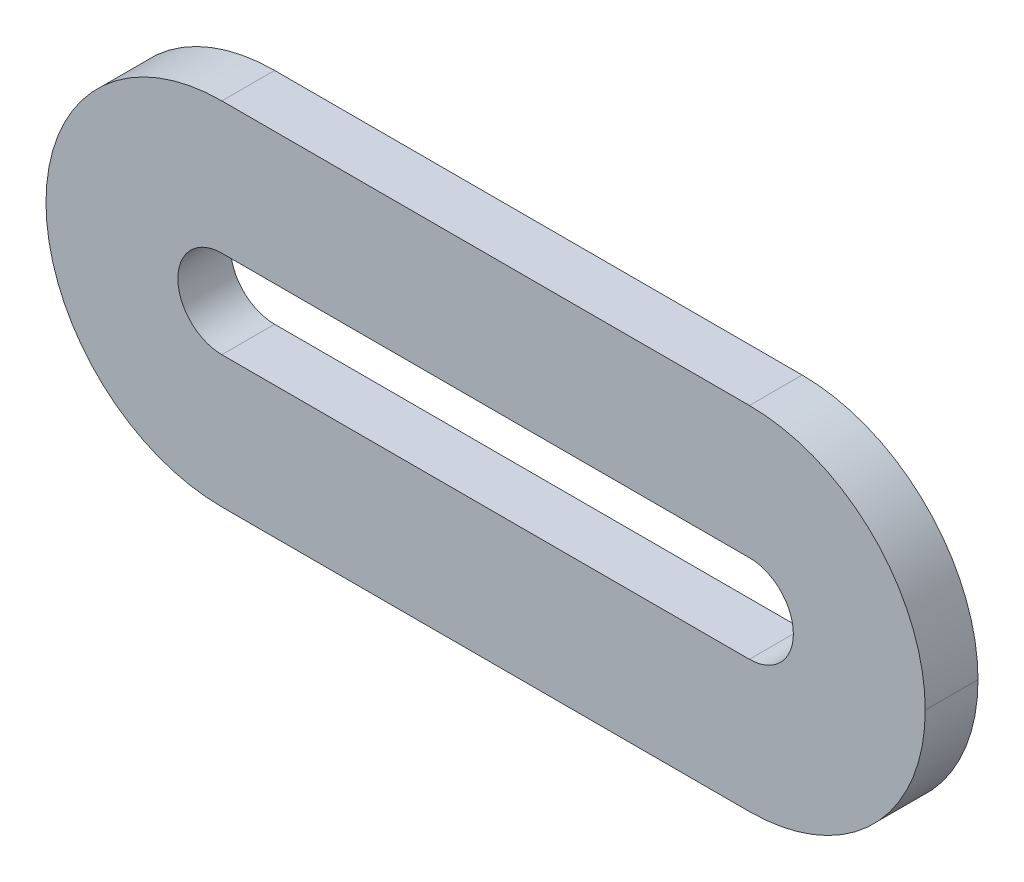
ISO-10303-21;
HEADER;
FILE_DESCRIPTION(('STEP AP214'),'2;1');
FILE_NAME('part.step','',(''),(''),'','','');
FILE_SCHEMA(('AUTOMOTIVE_DESIGN { 1 0 10303 214 1 1 1 1 }'));
ENDSEC;
DATA;
#1=APPLICATION_CONTEXT('core data for automotive mechanical design processes');
#2=APPLICATION_PROTOCOL_DEFINITION('international standard','automotive_design',2000,#1);
#3=PRODUCT_CONTEXT('',#1,'mechanical');
#4=PRODUCT('Part','Part','',(#3));
#5=PRODUCT_RELATED_PRODUCT_CATEGORY('part','',(#4));
#6=PRODUCT_DEFINITION_FORMATION('','',#4);
#7=PRODUCT_DEFINITION_CONTEXT('part definition',#1,'design');
#8=PRODUCT_DEFINITION('design','',#6,#7);
#9=PRODUCT_DEFINITION_SHAPE('','',#8);
#10=(LENGTH_UNIT() NAMED_UNIT(*) SI_UNIT(.MILLI.,.METRE.));
#11=(NAMED_UNIT(*) PLANE_ANGLE_UNIT() SI_UNIT($,.RADIAN.));
#12=(NAMED_UNIT(*) SI_UNIT($,.STERADIAN.) SOLID_ANGLE_UNIT());
#13=UNCERTAINTY_MEASURE_WITH_UNIT(LENGTH_MEASURE(1.E-05),#10,'distance_accuracy_value','');
#14=(GEOMETRIC_REPRESENTATION_CONTEXT(3) GLOBAL_UNCERTAINTY_ASSIGNED_CONTEXT((#13)) GLOBAL_UNIT_ASSIGNED_CONTEXT((#10,
#11,#12)) REPRESENTATION_CONTEXT('',''));
#15=CARTESIAN_POINT('',(0.,0.,0.));
#16=DIRECTION('',(0.,0.,1.));
#17=DIRECTION('',(1.,0.,0.));
#18=AXIS2_PLACEMENT_3D('',#15,#16,#17);
#19=CARTESIAN_POINT('',(0.,0.,3.));
#20=DIRECTION('',(0.,0.,-1.));
#21=DIRECTION('',(-1.,0.,0.));
#22=AXIS2_PLACEMENT_3D('',#19,#20,#21);
#23=PLANE('',#22);
#24=CARTESIAN_POINT('',(-15.,0.,3.));
#25=DIRECTION('',(0.,0.,-1.));
#26=DIRECTION('',(-1.,0.,0.));
#27=AXIS2_PLACEMENT_3D('',#24,#25,#26);
#28=CIRCLE('',#27,10.);
#29=CARTESIAN_POINT('',(-15.,10.,3.));
#30=VERTEX_POINT('',#29);
#31=CARTESIAN_POINT('',(-25.,0.,3.));
#32=VERTEX_POINT('',#31);
#33=EDGE_CURVE('E49',#30,#32,#28,.F.);
#34=ORIENTED_EDGE('',*,*,#33,.T.);
#35=CARTESIAN_POINT('',(-15.,0.,3.));
#36=DIRECTION('',(0.,0.,-1.));
#37=DIRECTION('',(-1.,0.,0.));
#38=AXIS2_PLACEMENT_3D('',#35,#36,#37);
#39=CIRCLE('',#38,10.);
#40=CARTESIAN_POINT('',(-15.,-10.,3.));
#41=VERTEX_POINT('',#40);
#42=EDGE_CURVE('E182',#32,#41,#39,.F.);
#43=ORIENTED_EDGE('',*,*,#42,.T.);
#44=DIRECTION('',(1.,0.,0.));
#45=VECTOR('',#44,1.);
#46=CARTESIAN_POINT('',(-25.,-10.,3.));
#47=LINE('',#46,#45);
#48=CARTESIAN_POINT('',(15.,-10.,3.));
#49=VERTEX_POINT('',#48);
#50=EDGE_CURVE('E156',#41,#49,#47,.T.);
#51=ORIENTED_EDGE('',*,*,#50,.T.);
#52=CARTESIAN_POINT('',(15.,0.,3.));
#53=DIRECTION('',(0.,0.,-1.));
#54=DIRECTION('',(-1.,0.,0.));
#55=AXIS2_PLACEMENT_3D('',#52,#53,#54);
#56=CIRCLE('',#55,10.);
#57=CARTESIAN_POINT('',(25.,0.,3.));
#58=VERTEX_POINT('',#57);
#59=EDGE_CURVE('E179',#49,#58,#56,.F.);
#60=ORIENTED_EDGE('',*,*,#59,.T.);
#61=CARTESIAN_POINT('',(15.,0.,3.));
#62=DIRECTION('',(0.,0.,-1.));
#63=DIRECTION('',(-1.,0.,0.));
#64=AXIS2_PLACEMENT_3D('',#61,#62,#63);
#65=CIRCLE('',#64,10.);
#66=CARTESIAN_POINT('',(15.,10.,3.));
#67=VERTEX_POINT('',#66);
#68=EDGE_CURVE('E177',#58,#67,#65,.F.);
#69=ORIENTED_EDGE('',*,*,#68,.T.);
#70=DIRECTION('',(-1.,0.,0.));
#71=VECTOR('',#70,1.);
#72=CARTESIAN_POINT('',(-25.,10.,3.));
#73=LINE('',#72,#71);
#74=EDGE_CURVE('E154',#67,#30,#73,.T.);
#75=ORIENTED_EDGE('',*,*,#74,.T.);
#76=EDGE_LOOP('',(#34,#43,#51,#60,#69,#75));
#77=FACE_BOUND('',#76,.T.);
#78=CARTESIAN_POINT('',(-15.,0.,3.));
#79=DIRECTION('',(0.,0.,1.));
#80=DIRECTION('',(1.,0.,0.));
#81=AXIS2_PLACEMENT_3D('',#78,#79,#80);
#82=CIRCLE('',#81,2.5);
#83=CARTESIAN_POINT('',(-15.,2.5,3.));
#84=VERTEX_POINT('',#83);
#85=CARTESIAN_POINT('',(-15.,-2.5,3.));
#86=VERTEX_POINT('',#85);
#87=EDGE_CURVE('E112',#84,#86,#82,.T.);
#88=ORIENTED_EDGE('',*,*,#87,.F.);
#89=DIRECTION('',(-1.,0.,0.));
#90=VECTOR('',#89,1.);
#91=CARTESIAN_POINT('',(-15.,2.5,3.));
#92=LINE('',#91,#90);
#93=CARTESIAN_POINT('',(15.,2.50000000000001,3.));
#94=VERTEX_POINT('',#93);
#95=EDGE_CURVE('E137',#94,#84,#92,.T.);
#96=ORIENTED_EDGE('',*,*,#95,.F.);
#97=CARTESIAN_POINT('',(15.,0.,3.));
#98=DIRECTION('',(0.,0.,1.));
#99=DIRECTION('',(1.,0.,0.));
#100=AXIS2_PLACEMENT_3D('',#97,#98,#99);
#101=CIRCLE('',#100,2.5);
#102=CARTESIAN_POINT('',(15.,-2.49999999999999,3.));
#103=VERTEX_POINT('',#102);
#104=EDGE_CURVE('E135',#103,#94,#101,.T.);
#105=ORIENTED_EDGE('',*,*,#104,.F.);
#106=DIRECTION('',(1.,0.,0.));
#107=VECTOR('',#106,1.);
#108=CARTESIAN_POINT('',(-15.,-2.5,3.));
#109=LINE('',#108,#107);
#110=EDGE_CURVE('E122',#86,#103,#109,.T.);
#111=ORIENTED_EDGE('',*,*,#110,.F.);
#112=EDGE_LOOP('',(#88,#96,#105,#111));
#113=FACE_BOUND('',#112,.T.);
#114=ADVANCED_FACE('F32',(#77,#113),#23,.F.);
#115=CARTESIAN_POINT('',(0.,0.,0.));
#116=DIRECTION('',(0.,0.,-1.));
#117=DIRECTION('',(-1.,0.,0.));
#118=AXIS2_PLACEMENT_3D('',#115,#116,#117);
#119=PLANE('',#118);
#120=DIRECTION('',(1.,0.,0.));
#121=VECTOR('',#120,1.);
#122=CARTESIAN_POINT('',(-25.,-10.,0.));
#123=LINE('',#122,#121);
#124=CARTESIAN_POINT('',(-15.,-10.,0.));
#125=VERTEX_POINT('',#124);
#126=CARTESIAN_POINT('',(15.,-10.,0.));
#127=VERTEX_POINT('',#126);
#128=EDGE_CURVE('E157',#125,#127,#123,.T.);
#129=ORIENTED_EDGE('',*,*,#128,.F.);
#130=CARTESIAN_POINT('',(-15.,0.,0.));
#131=DIRECTION('',(0.,0.,-1.));
#132=DIRECTION('',(-1.,0.,0.));
#133=AXIS2_PLACEMENT_3D('',#130,#131,#132);
#134=CIRCLE('',#133,10.);
#135=CARTESIAN_POINT('',(-25.,0.,0.));
#136=VERTEX_POINT('',#135);
#137=EDGE_CURVE('E169',#125,#136,#134,.T.);
#138=ORIENTED_EDGE('',*,*,#137,.T.);
#139=CARTESIAN_POINT('',(-15.,0.,0.));
#140=DIRECTION('',(0.,0.,-1.));
#141=DIRECTION('',(-1.,0.,0.));
#142=AXIS2_PLACEMENT_3D('',#139,#140,#141);
#143=CIRCLE('',#142,10.);
#144=CARTESIAN_POINT('',(-15.,10.,0.));
#145=VERTEX_POINT('',#144);
#146=EDGE_CURVE('E167',#136,#145,#143,.T.);
#147=ORIENTED_EDGE('',*,*,#146,.T.);
#148=DIRECTION('',(-1.,0.,0.));
#149=VECTOR('',#148,1.);
#150=CARTESIAN_POINT('',(-25.,10.,0.));
#151=LINE('',#150,#149);
#152=CARTESIAN_POINT('',(15.,10.,0.));
#153=VERTEX_POINT('',#152);
#154=EDGE_CURVE('E130',#153,#145,#151,.T.);
#155=ORIENTED_EDGE('',*,*,#154,.F.);
#156=CARTESIAN_POINT('',(15.,0.,0.));
#157=DIRECTION('',(0.,0.,-1.));
#158=DIRECTION('',(-1.,0.,0.));
#159=AXIS2_PLACEMENT_3D('',#156,#157,#158);
#160=CIRCLE('',#159,10.);
#161=CARTESIAN_POINT('',(25.,0.,0.));
#162=VERTEX_POINT('',#161);
#163=EDGE_CURVE('E160',#153,#162,#160,.T.);
#164=ORIENTED_EDGE('',*,*,#163,.T.);
#165=CARTESIAN_POINT('',(15.,0.,0.));
#166=DIRECTION('',(0.,0.,-1.));
#167=DIRECTION('',(-1.,0.,0.));
#168=AXIS2_PLACEMENT_3D('',#165,#166,#167);
#169=CIRCLE('',#168,10.);
#170=EDGE_CURVE('E165',#162,#127,#169,.T.);
#171=ORIENTED_EDGE('',*,*,#170,.T.);
#172=EDGE_LOOP('',(#129,#138,#147,#155,#164,#171));
#173=FACE_BOUND('',#172,.T.);
#174=DIRECTION('',(-1.,0.,0.));
#175=VECTOR('',#174,1.);
#176=CARTESIAN_POINT('',(-15.,2.5,0.));
#177=LINE('',#176,#175);
#178=CARTESIAN_POINT('',(15.,2.50000000000001,0.));
#179=VERTEX_POINT('',#178);
#180=CARTESIAN_POINT('',(-15.,2.5,0.));
#181=VERTEX_POINT('',#180);
#182=EDGE_CURVE('E123',#179,#181,#177,.T.);
#183=ORIENTED_EDGE('',*,*,#182,.T.);
#184=CARTESIAN_POINT('',(-15.,0.,0.));
#185=DIRECTION('',(0.,0.,1.));
#186=DIRECTION('',(1.,0.,0.));
#187=AXIS2_PLACEMENT_3D('',#184,#185,#186);
#188=CIRCLE('',#187,2.5);
#189=CARTESIAN_POINT('',(-15.,-2.5,0.));
#190=VERTEX_POINT('',#189);
#191=EDGE_CURVE('E141',#181,#190,#188,.T.);
#192=ORIENTED_EDGE('',*,*,#191,.T.);
#193=DIRECTION('',(1.,0.,0.));
#194=VECTOR('',#193,1.);
#195=CARTESIAN_POINT('',(-15.,-2.5,0.));
#196=LINE('',#195,#194);
#197=CARTESIAN_POINT('',(15.,-2.49999999999999,0.));
#198=VERTEX_POINT('',#197);
#199=EDGE_CURVE('E129',#190,#198,#196,.T.);
#200=ORIENTED_EDGE('',*,*,#199,.T.);
#201=CARTESIAN_POINT('',(15.,0.,0.));
#202=DIRECTION('',(0.,0.,1.));
#203=DIRECTION('',(1.,0.,0.));
#204=AXIS2_PLACEMENT_3D('',#201,#202,#203);
#205=CIRCLE('',#204,2.5);
#206=EDGE_CURVE('E145',#198,#179,#205,.T.);
#207=ORIENTED_EDGE('',*,*,#206,.T.);
#208=EDGE_LOOP('',(#183,#192,#200,#207));
#209=FACE_BOUND('',#208,.T.);
#210=ADVANCED_FACE('F198',(#173,#209),#119,.T.);
#211=CARTESIAN_POINT('',(-25.,10.,3.));
#212=DIRECTION('',(0.,-1.,0.));
#213=DIRECTION('',(0.,0.,-1.));
#214=AXIS2_PLACEMENT_3D('',#211,#212,#213);
#215=PLANE('',#214);
#216=ORIENTED_EDGE('',*,*,#154,.T.);
#217=DIRECTION('',(0.,0.,-1.));
#218=VECTOR('',#217,1.);
#219=CARTESIAN_POINT('',(-15.,10.,3.));
#220=LINE('',#219,#218);
#221=EDGE_CURVE('E11',#145,#30,#220,.F.);
#222=ORIENTED_EDGE('',*,*,#221,.T.);
#223=ORIENTED_EDGE('',*,*,#74,.F.);
#224=DIRECTION('',(0.,0.,-1.));
#225=VECTOR('',#224,1.);
#226=CARTESIAN_POINT('',(15.,10.,3.));
#227=LINE('',#226,#225);
#228=EDGE_CURVE('E41',#67,#153,#227,.T.);
#229=ORIENTED_EDGE('',*,*,#228,.T.);
#230=EDGE_LOOP('',(#216,#222,#223,#229));
#231=FACE_BOUND('',#230,.T.);
#232=ADVANCED_FACE('F201',(#231),#215,.F.);
#233=CARTESIAN_POINT('',(-25.,-10.,3.));
#234=DIRECTION('',(0.,1.,0.));
#235=DIRECTION('',(0.,0.,1.));
#236=AXIS2_PLACEMENT_3D('',#233,#234,#235);
#237=PLANE('',#236);
#238=ORIENTED_EDGE('',*,*,#128,.T.);
#239=DIRECTION('',(0.,0.,-1.));
#240=VECTOR('',#239,1.);
#241=CARTESIAN_POINT('',(15.,-10.,3.));
#242=LINE('',#241,#240);
#243=EDGE_CURVE('E174',#127,#49,#242,.F.);
#244=ORIENTED_EDGE('',*,*,#243,.T.);
#245=ORIENTED_EDGE('',*,*,#50,.F.);
#246=DIRECTION('',(0.,0.,-1.));
#247=VECTOR('',#246,1.);
#248=CARTESIAN_POINT('',(-15.,-10.,3.));
#249=LINE('',#248,#247);
#250=EDGE_CURVE('E171',#41,#125,#249,.T.);
#251=ORIENTED_EDGE('',*,*,#250,.T.);
#252=EDGE_LOOP('',(#238,#244,#245,#251));
#253=FACE_BOUND('',#252,.T.);
#254=ADVANCED_FACE('F208',(#253),#237,.F.);
#255=CARTESIAN_POINT('',(-15.,0.,3.));
#256=DIRECTION('',(0.,0.,-1.));
#257=DIRECTION('',(-1.,0.,0.));
#258=AXIS2_PLACEMENT_3D('',#255,#256,#257);
#259=CYLINDRICAL_SURFACE('',#258,2.5);
#260=ORIENTED_EDGE('',*,*,#191,.F.);
#261=DIRECTION('',(0.,0.,-1.));
#262=VECTOR('',#261,1.);
#263=CARTESIAN_POINT('',(-15.,2.5,3.));
#264=LINE('',#263,#262);
#265=EDGE_CURVE('E118',#84,#181,#264,.T.);
#266=ORIENTED_EDGE('',*,*,#265,.F.);
#267=ORIENTED_EDGE('',*,*,#87,.T.);
#268=DIRECTION('',(0.,0.,-1.));
#269=VECTOR('',#268,1.);
#270=CARTESIAN_POINT('',(-15.,-2.5,3.));
#271=LINE('',#270,#269);
#272=EDGE_CURVE('E115',#86,#190,#271,.T.);
#273=ORIENTED_EDGE('',*,*,#272,.T.);
#274=EDGE_LOOP('',(#260,#266,#267,#273));
#275=FACE_BOUND('',#274,.T.);
#276=ADVANCED_FACE('F114',(#275),#259,.F.);
#277=CARTESIAN_POINT('',(-15.,-2.5,3.));
#278=DIRECTION('',(0.,1.,0.));
#279=DIRECTION('',(-1.,0.,0.));
#280=AXIS2_PLACEMENT_3D('',#277,#278,#279);
#281=PLANE('',#280);
#282=ORIENTED_EDGE('',*,*,#199,.F.);
#283=ORIENTED_EDGE('',*,*,#272,.F.);
#284=ORIENTED_EDGE('',*,*,#110,.T.);
#285=DIRECTION('',(0.,0.,-1.));
#286=VECTOR('',#285,1.);
#287=CARTESIAN_POINT('',(15.,-2.49999999999999,3.));
#288=LINE('',#287,#286);
#289=EDGE_CURVE('E131',#103,#198,#288,.T.);
#290=ORIENTED_EDGE('',*,*,#289,.T.);
#291=EDGE_LOOP('',(#282,#283,#284,#290));
#292=FACE_BOUND('',#291,.T.);
#293=ADVANCED_FACE('F126',(#292),#281,.T.);
#294=CARTESIAN_POINT('',(15.,0.,3.));
#295=DIRECTION('',(0.,0.,-1.));
#296=DIRECTION('',(-1.,0.,0.));
#297=AXIS2_PLACEMENT_3D('',#294,#295,#296);
#298=CYLINDRICAL_SURFACE('',#297,2.5);
#299=ORIENTED_EDGE('',*,*,#206,.F.);
#300=ORIENTED_EDGE('',*,*,#289,.F.);
#301=ORIENTED_EDGE('',*,*,#104,.T.);
#302=DIRECTION('',(0.,0.,-1.));
#303=VECTOR('',#302,1.);
#304=CARTESIAN_POINT('',(15.,2.50000000000001,3.));
#305=LINE('',#304,#303);
#306=EDGE_CURVE('E151',#94,#179,#305,.T.);
#307=ORIENTED_EDGE('',*,*,#306,.T.);
#308=EDGE_LOOP('',(#299,#300,#301,#307));
#309=FACE_BOUND('',#308,.T.);
#310=ADVANCED_FACE('F249',(#309),#298,.F.);
#311=CARTESIAN_POINT('',(-15.,2.5,3.));
#312=DIRECTION('',(0.,-1.,0.));
#313=DIRECTION('',(1.,0.,0.));
#314=AXIS2_PLACEMENT_3D('',#311,#312,#313);
#315=PLANE('',#314);
#316=ORIENTED_EDGE('',*,*,#182,.F.);
#317=ORIENTED_EDGE('',*,*,#306,.F.);
#318=ORIENTED_EDGE('',*,*,#95,.T.);
#319=ORIENTED_EDGE('',*,*,#265,.T.);
#320=EDGE_LOOP('',(#316,#317,#318,#319));
#321=FACE_BOUND('',#320,.T.);
#322=ADVANCED_FACE('F227',(#321),#315,.T.);
#323=CARTESIAN_POINT('',(15.,0.,3.));
#324=DIRECTION('',(0.,0.,-1.));
#325=DIRECTION('',(-1.,0.,0.));
#326=AXIS2_PLACEMENT_3D('',#323,#324,#325);
#327=CYLINDRICAL_SURFACE('',#326,10.);
#328=ORIENTED_EDGE('',*,*,#228,.F.);
#329=ORIENTED_EDGE('',*,*,#68,.F.);
#330=DIRECTION('',(0.,0.,-1.));
#331=VECTOR('',#330,1.);
#332=CARTESIAN_POINT('',(25.,0.,3.));
#333=LINE('',#332,#331);
#334=EDGE_CURVE('E143',#162,#58,#333,.F.);
#335=ORIENTED_EDGE('',*,*,#334,.F.);
#336=ORIENTED_EDGE('',*,*,#163,.F.);
#337=EDGE_LOOP('',(#328,#329,#335,#336));
#338=FACE_BOUND('',#337,.T.);
#339=ADVANCED_FACE('F205',(#338),#327,.T.);
#340=CARTESIAN_POINT('',(15.,0.,3.));
#341=DIRECTION('',(0.,0.,-1.));
#342=DIRECTION('',(-1.,0.,0.));
#343=AXIS2_PLACEMENT_3D('',#340,#341,#342);
#344=CYLINDRICAL_SURFACE('',#343,10.);
#345=ORIENTED_EDGE('',*,*,#59,.F.);
#346=ORIENTED_EDGE('',*,*,#243,.F.);
#347=ORIENTED_EDGE('',*,*,#170,.F.);
#348=ORIENTED_EDGE('',*,*,#334,.T.);
#349=EDGE_LOOP('',(#345,#346,#347,#348));
#350=FACE_BOUND('',#349,.T.);
#351=ADVANCED_FACE('F210',(#350),#344,.T.);
#352=CARTESIAN_POINT('',(-15.,0.,3.));
#353=DIRECTION('',(0.,0.,-1.));
#354=DIRECTION('',(-1.,0.,0.));
#355=AXIS2_PLACEMENT_3D('',#352,#353,#354);
#356=CYLINDRICAL_SURFACE('',#355,10.);
#357=DIRECTION('',(0.,0.,-1.));
#358=VECTOR('',#357,1.);
#359=CARTESIAN_POINT('',(-25.,0.,3.));
#360=LINE('',#359,#358);
#361=EDGE_CURVE('E36',#32,#136,#360,.T.);
#362=ORIENTED_EDGE('',*,*,#361,.F.);
#363=ORIENTED_EDGE('',*,*,#33,.F.);
#364=ORIENTED_EDGE('',*,*,#221,.F.);
#365=ORIENTED_EDGE('',*,*,#146,.F.);
#366=EDGE_LOOP('',(#362,#363,#364,#365));
#367=FACE_BOUND('',#366,.T.);
#368=ADVANCED_FACE('F34',(#367),#356,.T.);
#369=CARTESIAN_POINT('',(-15.,0.,3.));
#370=DIRECTION('',(0.,0.,-1.));
#371=DIRECTION('',(-1.,0.,0.));
#372=AXIS2_PLACEMENT_3D('',#369,#370,#371);
#373=CYLINDRICAL_SURFACE('',#372,10.);
#374=ORIENTED_EDGE('',*,*,#42,.F.);
#375=ORIENTED_EDGE('',*,*,#361,.T.);
#376=ORIENTED_EDGE('',*,*,#137,.F.);
#377=ORIENTED_EDGE('',*,*,#250,.F.);
#378=EDGE_LOOP('',(#374,#375,#376,#377));
#379=FACE_BOUND('',#378,.T.);
#380=ADVANCED_FACE('F191',(#379),#373,.T.);
#381=CLOSED_SHELL('',(#114,#210,#232,#254,#276,#293,#310,#322,#339,#351,#368,#380));
#382=MANIFOLD_SOLID_BREP('B2',#381);
#383=ADVANCED_BREP_SHAPE_REPRESENTATION('',(#18,#382),#14);
#384=SHAPE_DEFINITION_REPRESENTATION(#9,#383);
ENDSEC;
END-ISO-10303-21;
